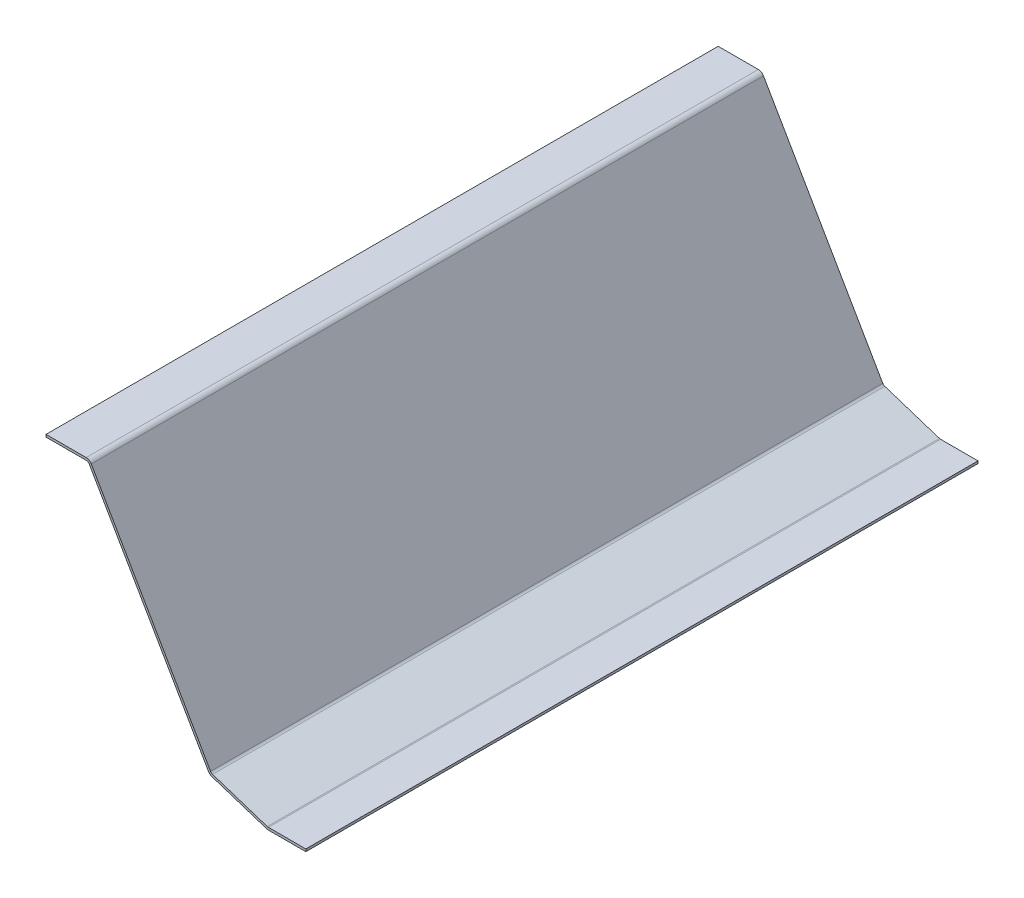
ISO-10303-21;
HEADER;
FILE_DESCRIPTION(('STEP AP214'),'2;1');
FILE_NAME('part.step','',(''),(''),'','','');
FILE_SCHEMA(('AUTOMOTIVE_DESIGN { 1 0 10303 214 1 1 1 1 }'));
ENDSEC;
DATA;
#1=APPLICATION_CONTEXT('core data for automotive mechanical design processes');
#2=APPLICATION_PROTOCOL_DEFINITION('international standard','automotive_design',2000,#1);
#3=PRODUCT_CONTEXT('',#1,'mechanical');
#4=PRODUCT('Part','Part','',(#3));
#5=PRODUCT_RELATED_PRODUCT_CATEGORY('part','',(#4));
#6=PRODUCT_DEFINITION_FORMATION('','',#4);
#7=PRODUCT_DEFINITION_CONTEXT('part definition',#1,'design');
#8=PRODUCT_DEFINITION('design','',#6,#7);
#9=PRODUCT_DEFINITION_SHAPE('','',#8);
#10=(LENGTH_UNIT() NAMED_UNIT(*) SI_UNIT(.MILLI.,.METRE.));
#11=(NAMED_UNIT(*) PLANE_ANGLE_UNIT() SI_UNIT($,.RADIAN.));
#12=(NAMED_UNIT(*) SI_UNIT($,.STERADIAN.) SOLID_ANGLE_UNIT());
#13=UNCERTAINTY_MEASURE_WITH_UNIT(LENGTH_MEASURE(1.E-05),#10,'distance_accuracy_value','');
#14=(GEOMETRIC_REPRESENTATION_CONTEXT(3) GLOBAL_UNCERTAINTY_ASSIGNED_CONTEXT((#13)) GLOBAL_UNIT_ASSIGNED_CONTEXT((#10,
#11,#12)) REPRESENTATION_CONTEXT('',''));
#15=CARTESIAN_POINT('',(0.,0.,0.));
#16=DIRECTION('',(0.,0.,1.));
#17=DIRECTION('',(1.,0.,0.));
#18=AXIS2_PLACEMENT_3D('',#15,#16,#17);
#19=CARTESIAN_POINT('',(94.280349977801,46.685130403089,141.));
#20=DIRECTION('',(0.,0.,-1.));
#21=DIRECTION('',(0.,-1.,0.));
#22=AXIS2_PLACEMENT_3D('',#19,#20,#21);
#23=PLANE('',#22);
#24=DIRECTION('',(0.,-1.,0.));
#25=VECTOR('',#24,1.);
#26=CARTESIAN_POINT('',(152.,3.,141.));
#27=LINE('',#26,#25);
#28=CARTESIAN_POINT('',(152.,3.,141.));
#29=VERTEX_POINT('',#28);
#30=CARTESIAN_POINT('',(152.,2.,141.));
#31=VERTEX_POINT('',#30);
#32=EDGE_CURVE('E25',#29,#31,#27,.T.);
#33=ORIENTED_EDGE('',*,*,#32,.F.);
#34=DIRECTION('',(1.,0.,0.));
#35=VECTOR('',#34,1.);
#36=CARTESIAN_POINT('',(136.31676888064,3.,141.));
#37=LINE('',#36,#35);
#38=CARTESIAN_POINT('',(136.31676888064,3.,141.));
#39=VERTEX_POINT('',#38);
#40=EDGE_CURVE('E226',#39,#29,#37,.T.);
#41=ORIENTED_EDGE('',*,*,#40,.F.);
#42=CARTESIAN_POINT('',(136.31676888064,4.5,141.));
#43=DIRECTION('',(0.,0.,1.));
#44=DIRECTION('',(-0.30901699437504,-0.951056516295123,0.));
#45=AXIS2_PLACEMENT_3D('',#42,#43,#44);
#46=CIRCLE('',#45,1.5);
#47=CARTESIAN_POINT('',(135.85324338908,3.073415225557,141.));
#48=VERTEX_POINT('',#47);
#49=EDGE_CURVE('E261',#48,#39,#46,.T.);
#50=ORIENTED_EDGE('',*,*,#49,.F.);
#51=DIRECTION('',(0.951056516295123,-0.30901699437504,0.));
#52=VECTOR('',#51,1.);
#53=CARTESIAN_POINT('',(112.88466128097,10.536359947027,141.));
#54=LINE('',#53,#52);
#55=CARTESIAN_POINT('',(112.88466128097,10.536359947027,141.));
#56=VERTEX_POINT('',#55);
#57=EDGE_CURVE('E257',#56,#48,#54,.T.);
#58=ORIENTED_EDGE('',*,*,#57,.F.);
#59=CARTESIAN_POINT('',(113.34818677253,11.96294472147,141.));
#60=DIRECTION('',(0.,0.,1.));
#61=DIRECTION('',(-0.866025403784329,-0.50000000000019,0.));
#62=AXIS2_PLACEMENT_3D('',#59,#60,#61);
#63=CIRCLE('',#62,1.5);
#64=CARTESIAN_POINT('',(112.04914866685,11.212944721469,141.));
#65=VERTEX_POINT('',#64);
#66=EDGE_CURVE('E243',#65,#56,#63,.T.);
#67=ORIENTED_EDGE('',*,*,#66,.F.);
#68=DIRECTION('',(0.50000000000019,-0.866025403784329,0.));
#69=VECTOR('',#68,1.);
#70=CARTESIAN_POINT('',(62.010362971082,97.882663895602,141.));
#71=LINE('',#70,#69);
#72=CARTESIAN_POINT('',(62.010362971082,97.882663895602,141.));
#73=VERTEX_POINT('',#72);
#74=EDGE_CURVE('E231',#73,#65,#71,.T.);
#75=ORIENTED_EDGE('',*,*,#74,.F.);
#76=CARTESIAN_POINT('',(59.845299461621,96.632663895602,141.));
#77=DIRECTION('',(0.,0.,-1.));
#78=DIRECTION('',(0.,1.,0.));
#79=AXIS2_PLACEMENT_3D('',#76,#77,#78);
#80=CIRCLE('',#79,2.5);
#81=CARTESIAN_POINT('',(59.845299461621,99.132663895602,141.));
#82=VERTEX_POINT('',#81);
#83=EDGE_CURVE('E213',#82,#73,#80,.T.);
#84=ORIENTED_EDGE('',*,*,#83,.F.);
#85=DIRECTION('',(1.,0.,0.));
#86=VECTOR('',#85,1.);
#87=CARTESIAN_POINT('',(43.,99.132663895602,141.));
#88=LINE('',#87,#86);
#89=CARTESIAN_POINT('',(43.,99.132663895602,141.));
#90=VERTEX_POINT('',#89);
#91=EDGE_CURVE('E169',#90,#82,#88,.T.);
#92=ORIENTED_EDGE('',*,*,#91,.F.);
#93=DIRECTION('',(0.,1.,0.));
#94=VECTOR('',#93,1.);
#95=CARTESIAN_POINT('',(43.,98.132663895602,141.));
#96=LINE('',#95,#94);
#97=CARTESIAN_POINT('',(43.,98.132663895602,141.));
#98=VERTEX_POINT('',#97);
#99=EDGE_CURVE('E163',#98,#90,#96,.T.);
#100=ORIENTED_EDGE('',*,*,#99,.F.);
#101=DIRECTION('',(-1.,0.,0.));
#102=VECTOR('',#101,1.);
#103=CARTESIAN_POINT('',(59.845299461621,98.132663895602,141.));
#104=LINE('',#103,#102);
#105=CARTESIAN_POINT('',(59.845299461621,98.132663895602,141.));
#106=VERTEX_POINT('',#105);
#107=EDGE_CURVE('E166',#106,#98,#104,.T.);
#108=ORIENTED_EDGE('',*,*,#107,.F.);
#109=CARTESIAN_POINT('',(59.845299461621,96.632663895602,141.));
#110=DIRECTION('',(0.,0.,1.));
#111=DIRECTION('',(0.866025403784329,0.50000000000019,0.));
#112=AXIS2_PLACEMENT_3D('',#109,#110,#111);
#113=CIRCLE('',#112,1.5);
#114=CARTESIAN_POINT('',(61.144337567297,97.382663895602,141.));
#115=VERTEX_POINT('',#114);
#116=EDGE_CURVE('E334',#115,#106,#113,.T.);
#117=ORIENTED_EDGE('',*,*,#116,.F.);
#118=DIRECTION('',(-0.50000000000019,0.866025403784329,0.));
#119=VECTOR('',#118,1.);
#120=CARTESIAN_POINT('',(111.18312326307,10.712944721469,141.));
#121=LINE('',#120,#119);
#122=CARTESIAN_POINT('',(111.18312326307,10.712944721469,141.));
#123=VERTEX_POINT('',#122);
#124=EDGE_CURVE('E312',#123,#115,#121,.T.);
#125=ORIENTED_EDGE('',*,*,#124,.F.);
#126=CARTESIAN_POINT('',(113.34818677253,11.96294472147,141.));
#127=DIRECTION('',(0.,0.,-1.));
#128=DIRECTION('',(-0.30901699437504,-0.951056516295123,0.));
#129=AXIS2_PLACEMENT_3D('',#126,#127,#128);
#130=CIRCLE('',#129,2.5);
#131=CARTESIAN_POINT('',(112.57564428659,9.585303430732,141.));
#132=VERTEX_POINT('',#131);
#133=EDGE_CURVE('E278',#132,#123,#130,.T.);
#134=ORIENTED_EDGE('',*,*,#133,.F.);
#135=DIRECTION('',(-0.951056516295123,0.30901699437504,0.));
#136=VECTOR('',#135,1.);
#137=CARTESIAN_POINT('',(135.54422639471,2.122358709262,141.));
#138=LINE('',#137,#136);
#139=CARTESIAN_POINT('',(135.54422639471,2.122358709262,141.));
#140=VERTEX_POINT('',#139);
#141=EDGE_CURVE('E306',#140,#132,#138,.T.);
#142=ORIENTED_EDGE('',*,*,#141,.F.);
#143=CARTESIAN_POINT('',(136.31676888064,4.5,141.));
#144=DIRECTION('',(0.,0.,-1.));
#145=DIRECTION('',(0.,-1.,0.));
#146=AXIS2_PLACEMENT_3D('',#143,#144,#145);
#147=CIRCLE('',#146,2.5);
#148=CARTESIAN_POINT('',(136.31676888064,2.,141.));
#149=VERTEX_POINT('',#148);
#150=EDGE_CURVE('E287',#149,#140,#147,.T.);
#151=ORIENTED_EDGE('',*,*,#150,.F.);
#152=DIRECTION('',(-1.,0.,0.));
#153=VECTOR('',#152,1.);
#154=CARTESIAN_POINT('',(152.,2.,141.));
#155=LINE('',#154,#153);
#156=EDGE_CURVE('E374',#31,#149,#155,.T.);
#157=ORIENTED_EDGE('',*,*,#156,.F.);
#158=EDGE_LOOP('',(#33,#41,#50,#58,#67,#75,#84,#92,#100,#108,#117,#125,#134,#142,#151,#157));
#159=FACE_BOUND('',#158,.T.);
#160=ADVANCED_FACE('F17',(#159),#23,.F.);
#161=CARTESIAN_POINT('',(94.280349977801,46.685130403089,-141.));
#162=DIRECTION('',(0.,0.,-1.));
#163=DIRECTION('',(0.,-1.,0.));
#164=AXIS2_PLACEMENT_3D('',#161,#162,#163);
#165=PLANE('',#164);
#166=DIRECTION('',(-1.,0.,0.));
#167=VECTOR('',#166,1.);
#168=CARTESIAN_POINT('',(152.,2.,-141.));
#169=LINE('',#168,#167);
#170=CARTESIAN_POINT('',(152.,2.,-141.));
#171=VERTEX_POINT('',#170);
#172=CARTESIAN_POINT('',(136.31676888064,2.,-141.));
#173=VERTEX_POINT('',#172);
#174=EDGE_CURVE('E283',#171,#173,#169,.T.);
#175=ORIENTED_EDGE('',*,*,#174,.T.);
#176=CARTESIAN_POINT('',(136.31676888064,4.5,-141.));
#177=DIRECTION('',(0.,0.,-1.));
#178=DIRECTION('',(0.,-1.,0.));
#179=AXIS2_PLACEMENT_3D('',#176,#177,#178);
#180=CIRCLE('',#179,2.5);
#181=CARTESIAN_POINT('',(135.54422639471,2.122358709262,-141.));
#182=VERTEX_POINT('',#181);
#183=EDGE_CURVE('E298',#173,#182,#180,.T.);
#184=ORIENTED_EDGE('',*,*,#183,.T.);
#185=DIRECTION('',(-0.951056516295123,0.30901699437504,0.));
#186=VECTOR('',#185,1.);
#187=CARTESIAN_POINT('',(135.54422639471,2.122358709262,-141.));
#188=LINE('',#187,#186);
#189=CARTESIAN_POINT('',(112.57564428659,9.585303430732,-141.));
#190=VERTEX_POINT('',#189);
#191=EDGE_CURVE('E282',#182,#190,#188,.T.);
#192=ORIENTED_EDGE('',*,*,#191,.T.);
#193=CARTESIAN_POINT('',(113.34818677253,11.96294472147,-141.));
#194=DIRECTION('',(0.,0.,-1.));
#195=DIRECTION('',(-0.30901699437504,-0.951056516295123,0.));
#196=AXIS2_PLACEMENT_3D('',#193,#194,#195);
#197=CIRCLE('',#196,2.5);
#198=CARTESIAN_POINT('',(111.18312326307,10.712944721469,-141.));
#199=VERTEX_POINT('',#198);
#200=EDGE_CURVE('E301',#190,#199,#197,.T.);
#201=ORIENTED_EDGE('',*,*,#200,.T.);
#202=DIRECTION('',(-0.50000000000019,0.866025403784329,0.));
#203=VECTOR('',#202,1.);
#204=CARTESIAN_POINT('',(111.18312326307,10.712944721469,-141.));
#205=LINE('',#204,#203);
#206=CARTESIAN_POINT('',(61.144337567297,97.382663895602,-141.));
#207=VERTEX_POINT('',#206);
#208=EDGE_CURVE('E311',#199,#207,#205,.T.);
#209=ORIENTED_EDGE('',*,*,#208,.T.);
#210=CARTESIAN_POINT('',(59.845299461621,96.632663895602,-141.));
#211=DIRECTION('',(0.,0.,1.));
#212=DIRECTION('',(0.866025403784329,0.50000000000019,0.));
#213=AXIS2_PLACEMENT_3D('',#210,#211,#212);
#214=CIRCLE('',#213,1.5);
#215=CARTESIAN_POINT('',(59.845299461621,98.132663895602,-141.));
#216=VERTEX_POINT('',#215);
#217=EDGE_CURVE('E191',#207,#216,#214,.T.);
#218=ORIENTED_EDGE('',*,*,#217,.T.);
#219=DIRECTION('',(-1.,0.,0.));
#220=VECTOR('',#219,1.);
#221=CARTESIAN_POINT('',(59.845299461621,98.132663895602,-141.));
#222=LINE('',#221,#220);
#223=CARTESIAN_POINT('',(43.,98.132663895602,-141.));
#224=VERTEX_POINT('',#223);
#225=EDGE_CURVE('E175',#216,#224,#222,.T.);
#226=ORIENTED_EDGE('',*,*,#225,.T.);
#227=DIRECTION('',(0.,1.,0.));
#228=VECTOR('',#227,1.);
#229=CARTESIAN_POINT('',(43.,98.132663895602,-141.));
#230=LINE('',#229,#228);
#231=CARTESIAN_POINT('',(43.,99.132663895602,-141.));
#232=VERTEX_POINT('',#231);
#233=EDGE_CURVE('E181',#224,#232,#230,.T.);
#234=ORIENTED_EDGE('',*,*,#233,.T.);
#235=DIRECTION('',(1.,0.,0.));
#236=VECTOR('',#235,1.);
#237=CARTESIAN_POINT('',(43.,99.132663895602,-141.));
#238=LINE('',#237,#236);
#239=CARTESIAN_POINT('',(59.845299461621,99.132663895602,-141.));
#240=VERTEX_POINT('',#239);
#241=EDGE_CURVE('E209',#232,#240,#238,.T.);
#242=ORIENTED_EDGE('',*,*,#241,.T.);
#243=CARTESIAN_POINT('',(59.845299461621,96.632663895602,-141.));
#244=DIRECTION('',(0.,0.,-1.));
#245=DIRECTION('',(0.,1.,0.));
#246=AXIS2_PLACEMENT_3D('',#243,#244,#245);
#247=CIRCLE('',#246,2.5);
#248=CARTESIAN_POINT('',(62.010362971082,97.882663895602,-141.));
#249=VERTEX_POINT('',#248);
#250=EDGE_CURVE('E221',#240,#249,#247,.T.);
#251=ORIENTED_EDGE('',*,*,#250,.T.);
#252=DIRECTION('',(0.50000000000019,-0.866025403784329,0.));
#253=VECTOR('',#252,1.);
#254=CARTESIAN_POINT('',(62.010362971082,97.882663895602,-141.));
#255=LINE('',#254,#253);
#256=CARTESIAN_POINT('',(112.04914866685,11.212944721469,-141.));
#257=VERTEX_POINT('',#256);
#258=EDGE_CURVE('E239',#249,#257,#255,.T.);
#259=ORIENTED_EDGE('',*,*,#258,.T.);
#260=CARTESIAN_POINT('',(113.34818677253,11.96294472147,-141.));
#261=DIRECTION('',(0.,0.,1.));
#262=DIRECTION('',(-0.866025403784329,-0.50000000000019,0.));
#263=AXIS2_PLACEMENT_3D('',#260,#261,#262);
#264=CIRCLE('',#263,1.5);
#265=CARTESIAN_POINT('',(112.88466128097,10.536359947027,-141.));
#266=VERTEX_POINT('',#265);
#267=EDGE_CURVE('E251',#257,#266,#264,.T.);
#268=ORIENTED_EDGE('',*,*,#267,.T.);
#269=DIRECTION('',(0.951056516295123,-0.30901699437504,0.));
#270=VECTOR('',#269,1.);
#271=CARTESIAN_POINT('',(112.88466128097,10.536359947027,-141.));
#272=LINE('',#271,#270);
#273=CARTESIAN_POINT('',(135.85324338908,3.073415225557,-141.));
#274=VERTEX_POINT('',#273);
#275=EDGE_CURVE('E256',#266,#274,#272,.T.);
#276=ORIENTED_EDGE('',*,*,#275,.T.);
#277=CARTESIAN_POINT('',(136.31676888064,4.5,-141.));
#278=DIRECTION('',(0.,0.,1.));
#279=DIRECTION('',(-0.30901699437504,-0.951056516295123,0.));
#280=AXIS2_PLACEMENT_3D('',#277,#278,#279);
#281=CIRCLE('',#280,1.5);
#282=CARTESIAN_POINT('',(136.31676888064,3.,-141.));
#283=VERTEX_POINT('',#282);
#284=EDGE_CURVE('E222',#274,#283,#281,.T.);
#285=ORIENTED_EDGE('',*,*,#284,.T.);
#286=DIRECTION('',(1.,0.,0.));
#287=VECTOR('',#286,1.);
#288=CARTESIAN_POINT('',(136.31676888064,3.,-141.));
#289=LINE('',#288,#287);
#290=CARTESIAN_POINT('',(152.,3.,-141.));
#291=VERTEX_POINT('',#290);
#292=EDGE_CURVE('E264',#283,#291,#289,.T.);
#293=ORIENTED_EDGE('',*,*,#292,.T.);
#294=DIRECTION('',(0.,-1.,0.));
#295=VECTOR('',#294,1.);
#296=CARTESIAN_POINT('',(152.,3.,-141.));
#297=LINE('',#296,#295);
#298=EDGE_CURVE('E11',#291,#171,#297,.T.);
#299=ORIENTED_EDGE('',*,*,#298,.T.);
#300=EDGE_LOOP('',(#175,#184,#192,#201,#209,#218,#226,#234,#242,#251,#259,#268,#276,#285,#293,#299));
#301=FACE_BOUND('',#300,.T.);
#302=ADVANCED_FACE('F418',(#301),#165,.T.);
#303=CARTESIAN_POINT('',(152.,3.,-141.));
#304=DIRECTION('',(1.,0.,0.));
#305=DIRECTION('',(0.,1.,0.));
#306=AXIS2_PLACEMENT_3D('',#303,#304,#305);
#307=PLANE('',#306);
#308=DIRECTION('',(0.,0.,1.));
#309=VECTOR('',#308,1.);
#310=CARTESIAN_POINT('',(152.,3.,-141.));
#311=LINE('',#310,#309);
#312=EDGE_CURVE('E262',#291,#29,#311,.T.);
#313=ORIENTED_EDGE('',*,*,#312,.T.);
#314=ORIENTED_EDGE('',*,*,#32,.T.);
#315=DIRECTION('',(0.,0.,1.));
#316=VECTOR('',#315,1.);
#317=CARTESIAN_POINT('',(152.,2.,-141.));
#318=LINE('',#317,#316);
#319=EDGE_CURVE('E384',#171,#31,#318,.T.);
#320=ORIENTED_EDGE('',*,*,#319,.F.);
#321=ORIENTED_EDGE('',*,*,#298,.F.);
#322=EDGE_LOOP('',(#313,#314,#320,#321));
#323=FACE_BOUND('',#322,.T.);
#324=ADVANCED_FACE('F419',(#323),#307,.T.);
#325=CARTESIAN_POINT('',(136.31676888064,3.,-141.));
#326=DIRECTION('',(0.,1.,0.));
#327=DIRECTION('',(1.,0.,0.));
#328=AXIS2_PLACEMENT_3D('',#325,#326,#327);
#329=PLANE('',#328);
#330=DIRECTION('',(0.,0.,1.));
#331=VECTOR('',#330,1.);
#332=CARTESIAN_POINT('',(136.31676888064,3.,-141.));
#333=LINE('',#332,#331);
#334=EDGE_CURVE('E227',#283,#39,#333,.T.);
#335=ORIENTED_EDGE('',*,*,#334,.T.);
#336=ORIENTED_EDGE('',*,*,#40,.T.);
#337=ORIENTED_EDGE('',*,*,#312,.F.);
#338=ORIENTED_EDGE('',*,*,#292,.F.);
#339=EDGE_LOOP('',(#335,#336,#337,#338));
#340=FACE_BOUND('',#339,.T.);
#341=ADVANCED_FACE('F399',(#340),#329,.T.);
#342=CARTESIAN_POINT('',(136.31676888064,4.5,-141.));
#343=DIRECTION('',(0.,0.,-1.));
#344=DIRECTION('',(-0.30901699437504,-0.951056516295123,0.));
#345=AXIS2_PLACEMENT_3D('',#342,#343,#344);
#346=CYLINDRICAL_SURFACE('',#345,1.5);
#347=DIRECTION('',(0.,0.,1.));
#348=VECTOR('',#347,1.);
#349=CARTESIAN_POINT('',(135.85324338908,3.073415225557,-141.));
#350=LINE('',#349,#348);
#351=EDGE_CURVE('E252',#274,#48,#350,.T.);
#352=ORIENTED_EDGE('',*,*,#351,.T.);
#353=ORIENTED_EDGE('',*,*,#49,.T.);
#354=ORIENTED_EDGE('',*,*,#334,.F.);
#355=ORIENTED_EDGE('',*,*,#284,.F.);
#356=EDGE_LOOP('',(#352,#353,#354,#355));
#357=FACE_BOUND('',#356,.T.);
#358=ADVANCED_FACE('F403',(#357),#346,.F.);
#359=CARTESIAN_POINT('',(112.88466128097,10.536359947027,-141.));
#360=DIRECTION('',(0.30901699437504,0.951056516295123,0.));
#361=DIRECTION('',(0.,0.,-1.));
#362=AXIS2_PLACEMENT_3D('',#359,#360,#361);
#363=PLANE('',#362);
#364=DIRECTION('',(0.,0.,1.));
#365=VECTOR('',#364,1.);
#366=CARTESIAN_POINT('',(112.88466128097,10.536359947027,-141.));
#367=LINE('',#366,#365);
#368=EDGE_CURVE('E247',#266,#56,#367,.T.);
#369=ORIENTED_EDGE('',*,*,#368,.T.);
#370=ORIENTED_EDGE('',*,*,#57,.T.);
#371=ORIENTED_EDGE('',*,*,#351,.F.);
#372=ORIENTED_EDGE('',*,*,#275,.F.);
#373=EDGE_LOOP('',(#369,#370,#371,#372));
#374=FACE_BOUND('',#373,.T.);
#375=ADVANCED_FACE('F405',(#374),#363,.T.);
#376=CARTESIAN_POINT('',(113.34818677253,11.96294472147,-141.));
#377=DIRECTION('',(0.,0.,-1.));
#378=DIRECTION('',(-0.866025403784329,-0.50000000000019,0.));
#379=AXIS2_PLACEMENT_3D('',#376,#377,#378);
#380=CYLINDRICAL_SURFACE('',#379,1.5);
#381=DIRECTION('',(0.,0.,1.));
#382=VECTOR('',#381,1.);
#383=CARTESIAN_POINT('',(112.04914866685,11.212944721469,-141.));
#384=LINE('',#383,#382);
#385=EDGE_CURVE('E235',#257,#65,#384,.T.);
#386=ORIENTED_EDGE('',*,*,#385,.T.);
#387=ORIENTED_EDGE('',*,*,#66,.T.);
#388=ORIENTED_EDGE('',*,*,#368,.F.);
#389=ORIENTED_EDGE('',*,*,#267,.F.);
#390=EDGE_LOOP('',(#386,#387,#388,#389));
#391=FACE_BOUND('',#390,.T.);
#392=ADVANCED_FACE('F408',(#391),#380,.F.);
#393=CARTESIAN_POINT('',(62.010362971082,97.882663895602,-141.));
#394=DIRECTION('',(0.866025403784329,0.50000000000019,0.));
#395=DIRECTION('',(0.,0.,-1.));
#396=AXIS2_PLACEMENT_3D('',#393,#394,#395);
#397=PLANE('',#396);
#398=DIRECTION('',(0.,0.,1.));
#399=VECTOR('',#398,1.);
#400=CARTESIAN_POINT('',(62.010362971082,97.882663895602,-141.));
#401=LINE('',#400,#399);
#402=EDGE_CURVE('E217',#249,#73,#401,.T.);
#403=ORIENTED_EDGE('',*,*,#402,.T.);
#404=ORIENTED_EDGE('',*,*,#74,.T.);
#405=ORIENTED_EDGE('',*,*,#385,.F.);
#406=ORIENTED_EDGE('',*,*,#258,.F.);
#407=EDGE_LOOP('',(#403,#404,#405,#406));
#408=FACE_BOUND('',#407,.T.);
#409=ADVANCED_FACE('F412',(#408),#397,.T.);
#410=CARTESIAN_POINT('',(59.845299461621,96.632663895602,-141.));
#411=DIRECTION('',(0.,0.,-1.));
#412=DIRECTION('',(0.,1.,0.));
#413=AXIS2_PLACEMENT_3D('',#410,#411,#412);
#414=CYLINDRICAL_SURFACE('',#413,2.5);
#415=DIRECTION('',(0.,0.,1.));
#416=VECTOR('',#415,1.);
#417=CARTESIAN_POINT('',(59.845299461621,99.132663895602,-141.));
#418=LINE('',#417,#416);
#419=EDGE_CURVE('E203',#240,#82,#418,.T.);
#420=ORIENTED_EDGE('',*,*,#419,.T.);
#421=ORIENTED_EDGE('',*,*,#83,.T.);
#422=ORIENTED_EDGE('',*,*,#402,.F.);
#423=ORIENTED_EDGE('',*,*,#250,.F.);
#424=EDGE_LOOP('',(#420,#421,#422,#423));
#425=FACE_BOUND('',#424,.T.);
#426=ADVANCED_FACE('F414',(#425),#414,.T.);
#427=CARTESIAN_POINT('',(43.,99.132663895602,-141.));
#428=DIRECTION('',(0.,1.,0.));
#429=DIRECTION('',(1.,0.,0.));
#430=AXIS2_PLACEMENT_3D('',#427,#428,#429);
#431=PLANE('',#430);
#432=DIRECTION('',(0.,0.,1.));
#433=VECTOR('',#432,1.);
#434=CARTESIAN_POINT('',(43.,99.132663895602,-141.));
#435=LINE('',#434,#433);
#436=EDGE_CURVE('E174',#232,#90,#435,.T.);
#437=ORIENTED_EDGE('',*,*,#436,.T.);
#438=ORIENTED_EDGE('',*,*,#91,.T.);
#439=ORIENTED_EDGE('',*,*,#419,.F.);
#440=ORIENTED_EDGE('',*,*,#241,.F.);
#441=EDGE_LOOP('',(#437,#438,#439,#440));
#442=FACE_BOUND('',#441,.T.);
#443=ADVANCED_FACE('F417',(#442),#431,.T.);
#444=CARTESIAN_POINT('',(43.,98.132663895602,-141.));
#445=DIRECTION('',(-1.,0.,0.));
#446=DIRECTION('',(0.,0.,1.));
#447=AXIS2_PLACEMENT_3D('',#444,#445,#446);
#448=PLANE('',#447);
#449=DIRECTION('',(0.,0.,1.));
#450=VECTOR('',#449,1.);
#451=CARTESIAN_POINT('',(43.,98.132663895602,-141.));
#452=LINE('',#451,#450);
#453=EDGE_CURVE('E178',#224,#98,#452,.T.);
#454=ORIENTED_EDGE('',*,*,#453,.T.);
#455=ORIENTED_EDGE('',*,*,#99,.T.);
#456=ORIENTED_EDGE('',*,*,#436,.F.);
#457=ORIENTED_EDGE('',*,*,#233,.F.);
#458=EDGE_LOOP('',(#454,#455,#456,#457));
#459=FACE_BOUND('',#458,.T.);
#460=ADVANCED_FACE('F179',(#459),#448,.T.);
#461=CARTESIAN_POINT('',(59.845299461621,98.132663895602,-141.));
#462=DIRECTION('',(0.,-1.,0.));
#463=DIRECTION('',(0.,0.,-1.));
#464=AXIS2_PLACEMENT_3D('',#461,#462,#463);
#465=PLANE('',#464);
#466=DIRECTION('',(0.,0.,1.));
#467=VECTOR('',#466,1.);
#468=CARTESIAN_POINT('',(59.845299461621,98.132663895602,-141.));
#469=LINE('',#468,#467);
#470=EDGE_CURVE('E188',#216,#106,#469,.T.);
#471=ORIENTED_EDGE('',*,*,#470,.T.);
#472=ORIENTED_EDGE('',*,*,#107,.T.);
#473=ORIENTED_EDGE('',*,*,#453,.F.);
#474=ORIENTED_EDGE('',*,*,#225,.F.);
#475=EDGE_LOOP('',(#471,#472,#473,#474));
#476=FACE_BOUND('',#475,.T.);
#477=ADVANCED_FACE('F186',(#476),#465,.T.);
#478=CARTESIAN_POINT('',(59.845299461621,96.632663895602,-141.));
#479=DIRECTION('',(0.,0.,-1.));
#480=DIRECTION('',(0.866025403784329,0.50000000000019,0.));
#481=AXIS2_PLACEMENT_3D('',#478,#479,#480);
#482=CYLINDRICAL_SURFACE('',#481,1.5);
#483=DIRECTION('',(0.,0.,1.));
#484=VECTOR('',#483,1.);
#485=CARTESIAN_POINT('',(61.144337567297,97.382663895602,-141.));
#486=LINE('',#485,#484);
#487=EDGE_CURVE('E307',#207,#115,#486,.T.);
#488=ORIENTED_EDGE('',*,*,#487,.T.);
#489=ORIENTED_EDGE('',*,*,#116,.T.);
#490=ORIENTED_EDGE('',*,*,#470,.F.);
#491=ORIENTED_EDGE('',*,*,#217,.F.);
#492=EDGE_LOOP('',(#488,#489,#490,#491));
#493=FACE_BOUND('',#492,.T.);
#494=ADVANCED_FACE('F359',(#493),#482,.F.);
#495=CARTESIAN_POINT('',(111.18312326307,10.712944721469,-141.));
#496=DIRECTION('',(-0.866025403784329,-0.50000000000019,0.));
#497=DIRECTION('',(-0.50000000000019,0.866025403784329,0.));
#498=AXIS2_PLACEMENT_3D('',#495,#496,#497);
#499=PLANE('',#498);
#500=DIRECTION('',(0.,0.,1.));
#501=VECTOR('',#500,1.);
#502=CARTESIAN_POINT('',(111.18312326307,10.712944721469,-141.));
#503=LINE('',#502,#501);
#504=EDGE_CURVE('E281',#199,#123,#503,.T.);
#505=ORIENTED_EDGE('',*,*,#504,.T.);
#506=ORIENTED_EDGE('',*,*,#124,.T.);
#507=ORIENTED_EDGE('',*,*,#487,.F.);
#508=ORIENTED_EDGE('',*,*,#208,.F.);
#509=EDGE_LOOP('',(#505,#506,#507,#508));
#510=FACE_BOUND('',#509,.T.);
#511=ADVANCED_FACE('F363',(#510),#499,.T.);
#512=CARTESIAN_POINT('',(113.34818677253,11.96294472147,-141.));
#513=DIRECTION('',(0.,0.,-1.));
#514=DIRECTION('',(-0.30901699437504,-0.951056516295123,0.));
#515=AXIS2_PLACEMENT_3D('',#512,#513,#514);
#516=CYLINDRICAL_SURFACE('',#515,2.5);
#517=DIRECTION('',(0.,0.,1.));
#518=VECTOR('',#517,1.);
#519=CARTESIAN_POINT('',(112.57564428659,9.585303430732,-141.));
#520=LINE('',#519,#518);
#521=EDGE_CURVE('E316',#190,#132,#520,.T.);
#522=ORIENTED_EDGE('',*,*,#521,.T.);
#523=ORIENTED_EDGE('',*,*,#133,.T.);
#524=ORIENTED_EDGE('',*,*,#504,.F.);
#525=ORIENTED_EDGE('',*,*,#200,.F.);
#526=EDGE_LOOP('',(#522,#523,#524,#525));
#527=FACE_BOUND('',#526,.T.);
#528=ADVANCED_FACE('F365',(#527),#516,.T.);
#529=CARTESIAN_POINT('',(135.54422639471,2.122358709262,-141.));
#530=DIRECTION('',(-0.30901699437504,-0.951056516295123,0.));
#531=DIRECTION('',(-0.951056516295123,0.30901699437504,0.));
#532=AXIS2_PLACEMENT_3D('',#529,#530,#531);
#533=PLANE('',#532);
#534=DIRECTION('',(0.,0.,1.));
#535=VECTOR('',#534,1.);
#536=CARTESIAN_POINT('',(135.54422639471,2.122358709262,-141.));
#537=LINE('',#536,#535);
#538=EDGE_CURVE('E294',#182,#140,#537,.T.);
#539=ORIENTED_EDGE('',*,*,#538,.T.);
#540=ORIENTED_EDGE('',*,*,#141,.T.);
#541=ORIENTED_EDGE('',*,*,#521,.F.);
#542=ORIENTED_EDGE('',*,*,#191,.F.);
#543=EDGE_LOOP('',(#539,#540,#541,#542));
#544=FACE_BOUND('',#543,.T.);
#545=ADVANCED_FACE('F369',(#544),#533,.T.);
#546=CARTESIAN_POINT('',(136.31676888064,4.5,-141.));
#547=DIRECTION('',(0.,0.,-1.));
#548=DIRECTION('',(0.,-1.,0.));
#549=AXIS2_PLACEMENT_3D('',#546,#547,#548);
#550=CYLINDRICAL_SURFACE('',#549,2.5);
#551=DIRECTION('',(0.,0.,1.));
#552=VECTOR('',#551,1.);
#553=CARTESIAN_POINT('',(136.31676888064,2.,-141.));
#554=LINE('',#553,#552);
#555=EDGE_CURVE('E276',#173,#149,#554,.T.);
#556=ORIENTED_EDGE('',*,*,#555,.T.);
#557=ORIENTED_EDGE('',*,*,#150,.T.);
#558=ORIENTED_EDGE('',*,*,#538,.F.);
#559=ORIENTED_EDGE('',*,*,#183,.F.);
#560=EDGE_LOOP('',(#556,#557,#558,#559));
#561=FACE_BOUND('',#560,.T.);
#562=ADVANCED_FACE('F380',(#561),#550,.T.);
#563=CARTESIAN_POINT('',(152.,2.,-141.));
#564=DIRECTION('',(0.,-1.,0.));
#565=DIRECTION('',(0.,0.,-1.));
#566=AXIS2_PLACEMENT_3D('',#563,#564,#565);
#567=PLANE('',#566);
#568=ORIENTED_EDGE('',*,*,#319,.T.);
#569=ORIENTED_EDGE('',*,*,#156,.T.);
#570=ORIENTED_EDGE('',*,*,#555,.F.);
#571=ORIENTED_EDGE('',*,*,#174,.F.);
#572=EDGE_LOOP('',(#568,#569,#570,#571));
#573=FACE_BOUND('',#572,.T.);
#574=ADVANCED_FACE('F383',(#573),#567,.T.);
#575=CLOSED_SHELL('',(#160,#302,#324,#341,#358,#375,#392,#409,#426,#443,#460,#477,#494,#511,
#528,#545,#562,#574));
#576=MANIFOLD_SOLID_BREP('B1',#575);
#577=ADVANCED_BREP_SHAPE_REPRESENTATION('',(#18,#576),#14);
#578=SHAPE_DEFINITION_REPRESENTATION(#9,#577);
ENDSEC;
END-ISO-10303-21;
